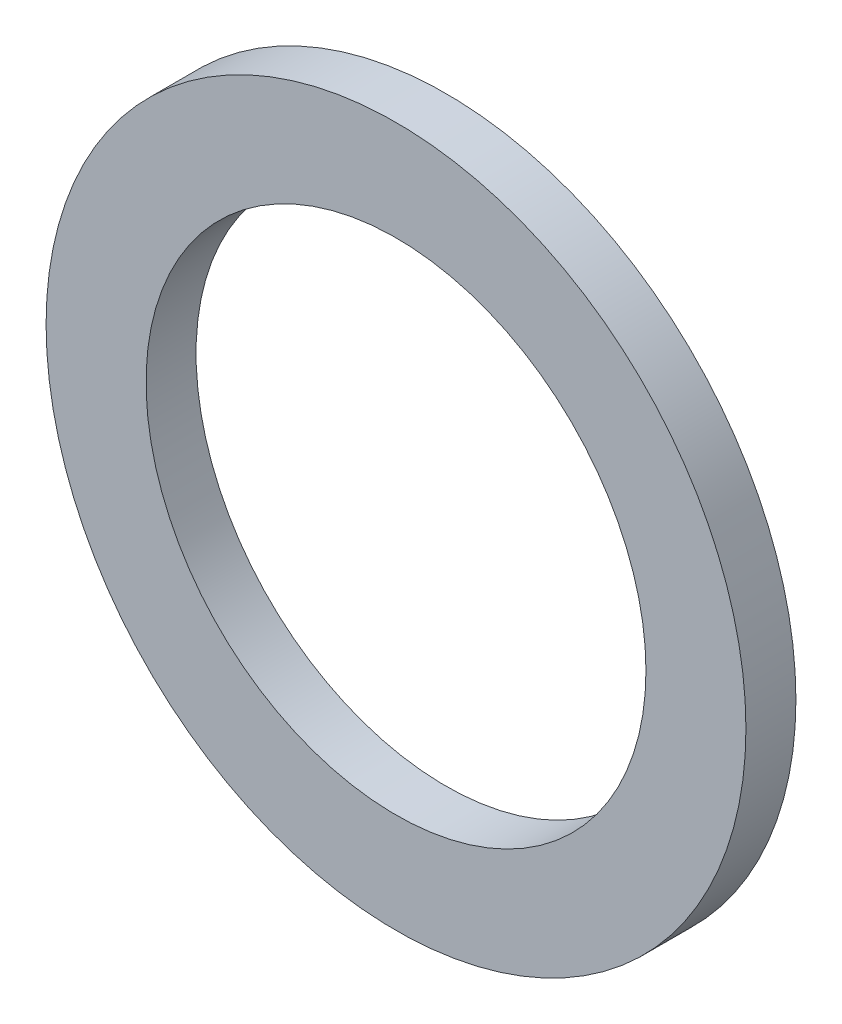
ISO-10303-21;
HEADER;
FILE_DESCRIPTION(('STEP AP214'),'2;1');
FILE_NAME('part.step','',(''),(''),'','','');
FILE_SCHEMA(('AUTOMOTIVE_DESIGN { 1 0 10303 214 1 1 1 1 }'));
ENDSEC;
DATA;
#1=APPLICATION_CONTEXT('core data for automotive mechanical design processes');
#2=APPLICATION_PROTOCOL_DEFINITION('international standard','automotive_design',2000,#1);
#3=PRODUCT_CONTEXT('',#1,'mechanical');
#4=PRODUCT('Part','Part','',(#3));
#5=PRODUCT_RELATED_PRODUCT_CATEGORY('part','',(#4));
#6=PRODUCT_DEFINITION_FORMATION('','',#4);
#7=PRODUCT_DEFINITION_CONTEXT('part definition',#1,'design');
#8=PRODUCT_DEFINITION('design','',#6,#7);
#9=PRODUCT_DEFINITION_SHAPE('','',#8);
#10=(LENGTH_UNIT() NAMED_UNIT(*) SI_UNIT(.MILLI.,.METRE.));
#11=(NAMED_UNIT(*) PLANE_ANGLE_UNIT() SI_UNIT($,.RADIAN.));
#12=(NAMED_UNIT(*) SI_UNIT($,.STERADIAN.) SOLID_ANGLE_UNIT());
#13=UNCERTAINTY_MEASURE_WITH_UNIT(LENGTH_MEASURE(1.E-05),#10,'distance_accuracy_value','');
#14=(GEOMETRIC_REPRESENTATION_CONTEXT(3) GLOBAL_UNCERTAINTY_ASSIGNED_CONTEXT((#13)) GLOBAL_UNIT_ASSIGNED_CONTEXT((#10,
#11,#12)) REPRESENTATION_CONTEXT('',''));
#15=CARTESIAN_POINT('',(0.,0.,0.));
#16=DIRECTION('',(0.,0.,1.));
#17=DIRECTION('',(1.,0.,0.));
#18=AXIS2_PLACEMENT_3D('',#15,#16,#17);
#19=CARTESIAN_POINT('',(0.,0.,0.5));
#20=DIRECTION('',(0.,0.,1.));
#21=DIRECTION('',(1.,0.,0.));
#22=AXIS2_PLACEMENT_3D('',#19,#20,#21);
#23=PLANE('',#22);
#24=CARTESIAN_POINT('',(0.,0.,0.5));
#25=DIRECTION('',(0.,0.,1.));
#26=DIRECTION('',(1.,0.,0.));
#27=AXIS2_PLACEMENT_3D('',#24,#25,#26);
#28=CIRCLE('',#27,3.5);
#29=CARTESIAN_POINT('',(3.5,0.,0.5));
#30=VERTEX_POINT('',#29);
#31=EDGE_CURVE('E10',#30,#30,#28,.T.);
#32=ORIENTED_EDGE('',*,*,#31,.T.);
#33=EDGE_LOOP('',(#32));
#34=FACE_BOUND('',#33,.T.);
#35=CARTESIAN_POINT('',(0.,0.,0.5));
#36=DIRECTION('',(0.,0.,1.));
#37=DIRECTION('',(1.,0.,0.));
#38=AXIS2_PLACEMENT_3D('',#35,#36,#37);
#39=CIRCLE('',#38,2.5);
#40=CARTESIAN_POINT('',(2.5,0.,0.5));
#41=VERTEX_POINT('',#40);
#42=EDGE_CURVE('E50',#41,#41,#39,.T.);
#43=ORIENTED_EDGE('',*,*,#42,.F.);
#44=EDGE_LOOP('',(#43));
#45=FACE_BOUND('',#44,.T.);
#46=ADVANCED_FACE('F39',(#34,#45),#23,.T.);
#47=CARTESIAN_POINT('',(0.,0.,0.));
#48=DIRECTION('',(0.,0.,1.));
#49=DIRECTION('',(1.,0.,0.));
#50=AXIS2_PLACEMENT_3D('',#47,#48,#49);
#51=PLANE('',#50);
#52=CARTESIAN_POINT('',(0.,0.,0.));
#53=DIRECTION('',(0.,0.,1.));
#54=DIRECTION('',(1.,0.,0.));
#55=AXIS2_PLACEMENT_3D('',#52,#53,#54);
#56=CIRCLE('',#55,3.5);
#57=CARTESIAN_POINT('',(3.5,0.,0.));
#58=VERTEX_POINT('',#57);
#59=EDGE_CURVE('E43',#58,#58,#56,.T.);
#60=ORIENTED_EDGE('',*,*,#59,.F.);
#61=EDGE_LOOP('',(#60));
#62=FACE_BOUND('',#61,.T.);
#63=CARTESIAN_POINT('',(0.,0.,0.));
#64=DIRECTION('',(0.,0.,1.));
#65=DIRECTION('',(1.,0.,0.));
#66=AXIS2_PLACEMENT_3D('',#63,#64,#65);
#67=CIRCLE('',#66,2.5);
#68=CARTESIAN_POINT('',(2.5,0.,0.));
#69=VERTEX_POINT('',#68);
#70=EDGE_CURVE('E52',#69,#69,#67,.T.);
#71=ORIENTED_EDGE('',*,*,#70,.T.);
#72=EDGE_LOOP('',(#71));
#73=FACE_BOUND('',#72,.T.);
#74=ADVANCED_FACE('F62',(#62,#73),#51,.F.);
#75=CARTESIAN_POINT('',(0.,0.,0.5));
#76=DIRECTION('',(0.,0.,-1.));
#77=DIRECTION('',(-1.,0.,0.));
#78=AXIS2_PLACEMENT_3D('',#75,#76,#77);
#79=CYLINDRICAL_SURFACE('',#78,3.5);
#80=ORIENTED_EDGE('',*,*,#31,.F.);
#81=EDGE_LOOP('',(#80));
#82=FACE_BOUND('',#81,.T.);
#83=ORIENTED_EDGE('',*,*,#59,.T.);
#84=EDGE_LOOP('',(#83));
#85=FACE_BOUND('',#84,.T.);
#86=ADVANCED_FACE('F41',(#82,#85),#79,.T.);
#87=CARTESIAN_POINT('',(0.,0.,0.5));
#88=DIRECTION('',(0.,0.,-1.));
#89=DIRECTION('',(-1.,0.,0.));
#90=AXIS2_PLACEMENT_3D('',#87,#88,#89);
#91=CYLINDRICAL_SURFACE('',#90,2.5);
#92=ORIENTED_EDGE('',*,*,#42,.T.);
#93=EDGE_LOOP('',(#92));
#94=FACE_BOUND('',#93,.T.);
#95=ORIENTED_EDGE('',*,*,#70,.F.);
#96=EDGE_LOOP('',(#95));
#97=FACE_BOUND('',#96,.T.);
#98=ADVANCED_FACE('F58',(#94,#97),#91,.F.);
#99=CLOSED_SHELL('',(#46,#74,#86,#98));
#100=MANIFOLD_SOLID_BREP('B2',#99);
#101=ADVANCED_BREP_SHAPE_REPRESENTATION('',(#18,#100),#14);
#102=SHAPE_DEFINITION_REPRESENTATION(#9,#101);
ENDSEC;
END-ISO-10303-21;
